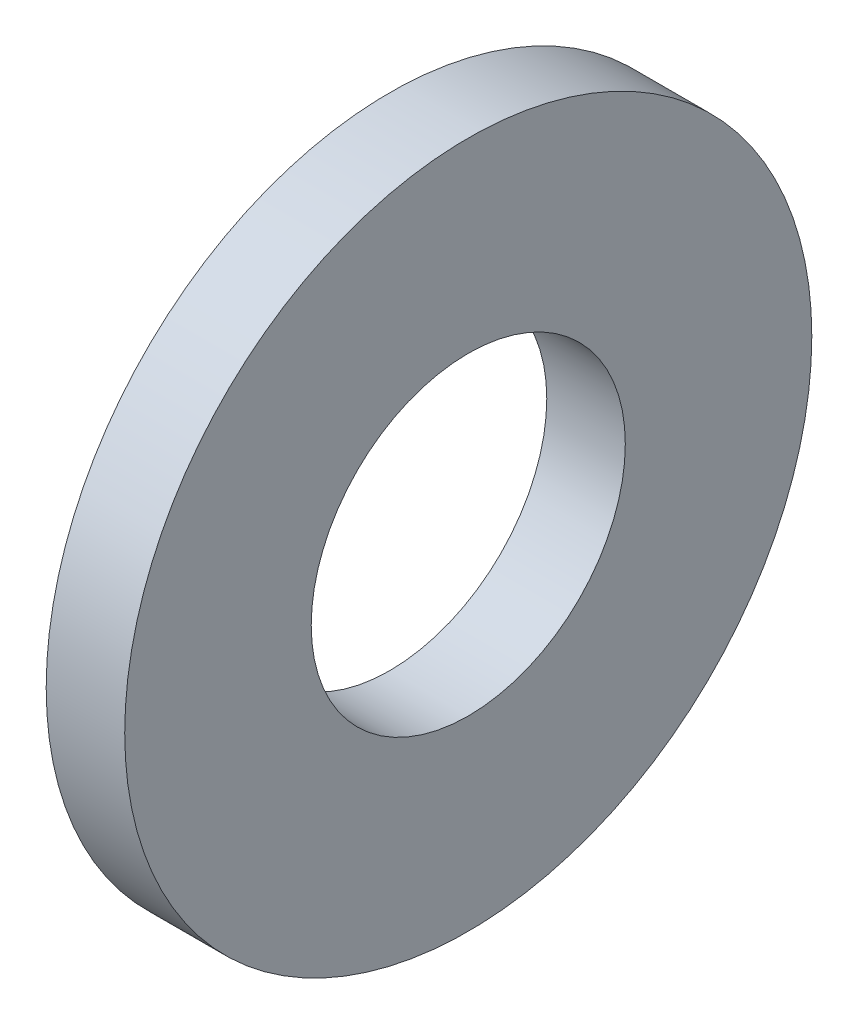
ISO-10303-21;
HEADER;
FILE_DESCRIPTION(('STEP AP214'),'2;1');
FILE_NAME('part.step','',(''),(''),'','','');
FILE_SCHEMA(('AUTOMOTIVE_DESIGN { 1 0 10303 214 1 1 1 1 }'));
ENDSEC;
DATA;
#1=APPLICATION_CONTEXT('core data for automotive mechanical design processes');
#2=APPLICATION_PROTOCOL_DEFINITION('international standard','automotive_design',2000,#1);
#3=PRODUCT_CONTEXT('',#1,'mechanical');
#4=PRODUCT('Part','Part','',(#3));
#5=PRODUCT_RELATED_PRODUCT_CATEGORY('part','',(#4));
#6=PRODUCT_DEFINITION_FORMATION('','',#4);
#7=PRODUCT_DEFINITION_CONTEXT('part definition',#1,'design');
#8=PRODUCT_DEFINITION('design','',#6,#7);
#9=PRODUCT_DEFINITION_SHAPE('','',#8);
#10=(LENGTH_UNIT() NAMED_UNIT(*) SI_UNIT(.MILLI.,.METRE.));
#11=(NAMED_UNIT(*) PLANE_ANGLE_UNIT() SI_UNIT($,.RADIAN.));
#12=(NAMED_UNIT(*) SI_UNIT($,.STERADIAN.) SOLID_ANGLE_UNIT());
#13=UNCERTAINTY_MEASURE_WITH_UNIT(LENGTH_MEASURE(1.E-05),#10,'distance_accuracy_value','');
#14=(GEOMETRIC_REPRESENTATION_CONTEXT(3) GLOBAL_UNCERTAINTY_ASSIGNED_CONTEXT((#13)) GLOBAL_UNIT_ASSIGNED_CONTEXT((#10,
#11,#12)) REPRESENTATION_CONTEXT('',''));
#15=CARTESIAN_POINT('',(0.,0.,0.));
#16=DIRECTION('',(0.,0.,1.));
#17=DIRECTION('',(1.,0.,0.));
#18=AXIS2_PLACEMENT_3D('',#15,#16,#17);
#19=CARTESIAN_POINT('',(54.708348754,-19.,-12.));
#20=DIRECTION('',(-1.,0.,0.));
#21=DIRECTION('',(0.,0.,1.));
#22=AXIS2_PLACEMENT_3D('',#19,#20,#21);
#23=CYLINDRICAL_SURFACE('',#22,3.5);
#24=CARTESIAN_POINT('',(54.708348754,-19.,-12.));
#25=DIRECTION('',(1.,0.,0.));
#26=DIRECTION('',(0.,0.,-1.));
#27=AXIS2_PLACEMENT_3D('',#24,#25,#26);
#28=CIRCLE('',#27,3.5);
#29=CARTESIAN_POINT('',(54.708348754,-19.,-15.5));
#30=VERTEX_POINT('',#29);
#31=EDGE_CURVE('E10',#30,#30,#28,.T.);
#32=ORIENTED_EDGE('',*,*,#31,.F.);
#33=EDGE_LOOP('',(#32));
#34=FACE_BOUND('',#33,.T.);
#35=CARTESIAN_POINT('',(53.908348754,-19.,-12.));
#36=DIRECTION('',(1.,0.,0.));
#37=DIRECTION('',(0.,0.,-1.));
#38=AXIS2_PLACEMENT_3D('',#35,#36,#37);
#39=CIRCLE('',#38,3.5);
#40=CARTESIAN_POINT('',(53.908348754,-19.,-15.5));
#41=VERTEX_POINT('',#40);
#42=EDGE_CURVE('E46',#41,#41,#39,.T.);
#43=ORIENTED_EDGE('',*,*,#42,.T.);
#44=EDGE_LOOP('',(#43));
#45=FACE_BOUND('',#44,.T.);
#46=ADVANCED_FACE('F39',(#34,#45),#23,.T.);
#47=CARTESIAN_POINT('',(54.708348754,-19.,-12.));
#48=DIRECTION('',(1.,0.,0.));
#49=DIRECTION('',(0.,0.,-1.));
#50=AXIS2_PLACEMENT_3D('',#47,#48,#49);
#51=PLANE('',#50);
#52=CARTESIAN_POINT('',(54.708348754,-19.,-12.));
#53=DIRECTION('',(1.,0.,0.));
#54=DIRECTION('',(0.,0.,-1.));
#55=AXIS2_PLACEMENT_3D('',#52,#53,#54);
#56=CIRCLE('',#55,1.6);
#57=CARTESIAN_POINT('',(54.708348754,-19.,-13.6));
#58=VERTEX_POINT('',#57);
#59=EDGE_CURVE('E51',#58,#58,#56,.F.);
#60=ORIENTED_EDGE('',*,*,#59,.T.);
#61=EDGE_LOOP('',(#60));
#62=FACE_BOUND('',#61,.T.);
#63=ORIENTED_EDGE('',*,*,#31,.T.);
#64=EDGE_LOOP('',(#63));
#65=FACE_BOUND('',#64,.T.);
#66=ADVANCED_FACE('F63',(#62,#65),#51,.T.);
#67=CARTESIAN_POINT('',(53.908348754,-19.,-12.));
#68=DIRECTION('',(1.,0.,0.));
#69=DIRECTION('',(0.,0.,-1.));
#70=AXIS2_PLACEMENT_3D('',#67,#68,#69);
#71=PLANE('',#70);
#72=CARTESIAN_POINT('',(53.908348754,-19.,-12.));
#73=DIRECTION('',(1.,0.,0.));
#74=DIRECTION('',(0.,0.,-1.));
#75=AXIS2_PLACEMENT_3D('',#72,#73,#74);
#76=CIRCLE('',#75,1.6);
#77=CARTESIAN_POINT('',(53.908348754,-19.,-13.6));
#78=VERTEX_POINT('',#77);
#79=EDGE_CURVE('E45',#78,#78,#76,.F.);
#80=ORIENTED_EDGE('',*,*,#79,.F.);
#81=EDGE_LOOP('',(#80));
#82=FACE_BOUND('',#81,.T.);
#83=ORIENTED_EDGE('',*,*,#42,.F.);
#84=EDGE_LOOP('',(#83));
#85=FACE_BOUND('',#84,.T.);
#86=ADVANCED_FACE('F61',(#82,#85),#71,.F.);
#87=CARTESIAN_POINT('',(54.808348754,-19.,-12.));
#88=DIRECTION('',(-1.,0.,0.));
#89=DIRECTION('',(0.,0.,1.));
#90=AXIS2_PLACEMENT_3D('',#87,#88,#89);
#91=CYLINDRICAL_SURFACE('',#90,1.6);
#92=ORIENTED_EDGE('',*,*,#59,.F.);
#93=EDGE_LOOP('',(#92));
#94=FACE_BOUND('',#93,.T.);
#95=ORIENTED_EDGE('',*,*,#79,.T.);
#96=EDGE_LOOP('',(#95));
#97=FACE_BOUND('',#96,.T.);
#98=ADVANCED_FACE('F56',(#94,#97),#91,.F.);
#99=CLOSED_SHELL('',(#46,#66,#86,#98));
#100=MANIFOLD_SOLID_BREP('B2',#99);
#101=ADVANCED_BREP_SHAPE_REPRESENTATION('',(#18,#100),#14);
#102=SHAPE_DEFINITION_REPRESENTATION(#9,#101);
ENDSEC;
END-ISO-10303-21;
